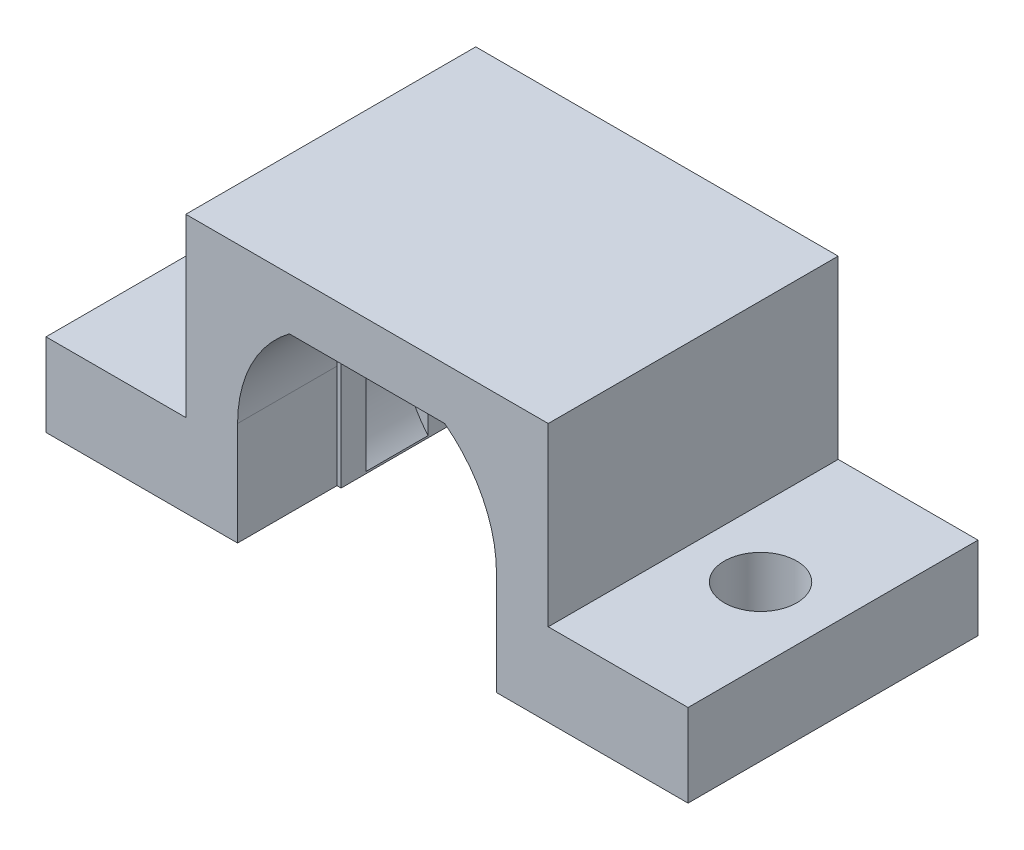
ISO-10303-21;
HEADER;
FILE_DESCRIPTION(('STEP AP214'),'2;1');
FILE_NAME('part.step','',(''),(''),'','','');
FILE_SCHEMA(('AUTOMOTIVE_DESIGN { 1 0 10303 214 1 1 1 1 }'));
ENDSEC;
DATA;
#1=APPLICATION_CONTEXT('core data for automotive mechanical design processes');
#2=APPLICATION_PROTOCOL_DEFINITION('international standard','automotive_design',2000,#1);
#3=PRODUCT_CONTEXT('',#1,'mechanical');
#4=PRODUCT('Part','Part','',(#3));
#5=PRODUCT_RELATED_PRODUCT_CATEGORY('part','',(#4));
#6=PRODUCT_DEFINITION_FORMATION('','',#4);
#7=PRODUCT_DEFINITION_CONTEXT('part definition',#1,'design');
#8=PRODUCT_DEFINITION('design','',#6,#7);
#9=PRODUCT_DEFINITION_SHAPE('','',#8);
#10=(LENGTH_UNIT() NAMED_UNIT(*) SI_UNIT(.MILLI.,.METRE.));
#11=(NAMED_UNIT(*) PLANE_ANGLE_UNIT() SI_UNIT($,.RADIAN.));
#12=(NAMED_UNIT(*) SI_UNIT($,.STERADIAN.) SOLID_ANGLE_UNIT());
#13=UNCERTAINTY_MEASURE_WITH_UNIT(LENGTH_MEASURE(1.E-05),#10,'distance_accuracy_value','');
#14=(GEOMETRIC_REPRESENTATION_CONTEXT(3) GLOBAL_UNCERTAINTY_ASSIGNED_CONTEXT((#13)) GLOBAL_UNIT_ASSIGNED_CONTEXT((#10,
#11,#12)) REPRESENTATION_CONTEXT('',''));
#15=CARTESIAN_POINT('',(0.,0.,0.));
#16=DIRECTION('',(0.,0.,1.));
#17=DIRECTION('',(1.,0.,0.));
#18=AXIS2_PLACEMENT_3D('',#15,#16,#17);
#19=CARTESIAN_POINT('',(-6.05,19.2021736562619,2.2));
#20=DIRECTION('',(1.,0.,0.));
#21=DIRECTION('',(0.,0.,-1.));
#22=AXIS2_PLACEMENT_3D('',#19,#20,#21);
#23=PLANE('',#22);
#24=DIRECTION('',(0.,-1.,0.));
#25=VECTOR('',#24,1.);
#26=CARTESIAN_POINT('',(-6.05,19.2021736562619,-7.));
#27=LINE('',#26,#25);
#28=CARTESIAN_POINT('',(-6.05,10.,-7.));
#29=VERTEX_POINT('',#28);
#30=CARTESIAN_POINT('',(-6.05,0.,-7.));
#31=VERTEX_POINT('',#30);
#32=EDGE_CURVE('E254',#29,#31,#27,.T.);
#33=ORIENTED_EDGE('',*,*,#32,.F.);
#34=DIRECTION('',(0.,0.,1.));
#35=VECTOR('',#34,1.);
#36=CARTESIAN_POINT('',(-6.05,10.,2.2));
#37=LINE('',#36,#35);
#38=CARTESIAN_POINT('',(-6.05,10.,2.2));
#39=VERTEX_POINT('',#38);
#40=EDGE_CURVE('E250',#29,#39,#37,.T.);
#41=ORIENTED_EDGE('',*,*,#40,.T.);
#42=DIRECTION('',(0.,-1.,0.));
#43=VECTOR('',#42,1.);
#44=CARTESIAN_POINT('',(-6.05,19.2021736562619,2.2));
#45=LINE('',#44,#43);
#46=CARTESIAN_POINT('',(-6.05,6.56843871413581,2.2));
#47=VERTEX_POINT('',#46);
#48=EDGE_CURVE('E259',#39,#47,#45,.T.);
#49=ORIENTED_EDGE('',*,*,#48,.T.);
#50=CARTESIAN_POINT('',(-6.05,0.,2.2));
#51=VERTEX_POINT('',#50);
#52=EDGE_CURVE('E253',#47,#51,#45,.T.);
#53=ORIENTED_EDGE('',*,*,#52,.T.);
#54=DIRECTION('',(0.,0.,1.));
#55=VECTOR('',#54,1.);
#56=CARTESIAN_POINT('',(-6.05,0.,2.2));
#57=LINE('',#56,#55);
#58=EDGE_CURVE('E242',#31,#51,#57,.T.);
#59=ORIENTED_EDGE('',*,*,#58,.F.);
#60=EDGE_LOOP('',(#33,#41,#49,#53,#59));
#61=FACE_BOUND('',#60,.T.);
#62=DIRECTION('',(0.,0.,1.));
#63=VECTOR('',#62,1.);
#64=CARTESIAN_POINT('',(-6.05,5.93643545649787,-2.));
#65=LINE('',#64,#63);
#66=CARTESIAN_POINT('',(-6.05,5.93643545649787,-2.));
#67=VERTEX_POINT('',#66);
#68=CARTESIAN_POINT('',(-6.05,5.93643545649787,1.));
#69=VERTEX_POINT('',#68);
#70=EDGE_CURVE('E412',#67,#69,#65,.T.);
#71=ORIENTED_EDGE('',*,*,#70,.F.);
#72=DIRECTION('',(0.,-1.,0.));
#73=VECTOR('',#72,1.);
#74=CARTESIAN_POINT('',(-6.05,19.2021736562619,-2.));
#75=LINE('',#74,#73);
#76=CARTESIAN_POINT('',(-6.05,0.0945535764110927,-2.));
#77=VERTEX_POINT('',#76);
#78=EDGE_CURVE('E415',#67,#77,#75,.T.);
#79=ORIENTED_EDGE('',*,*,#78,.T.);
#80=DIRECTION('',(0.,0.,1.));
#81=VECTOR('',#80,1.);
#82=CARTESIAN_POINT('',(-6.05,0.0945535764110927,-2.));
#83=LINE('',#82,#81);
#84=CARTESIAN_POINT('',(-6.05,0.0945535764110927,1.));
#85=VERTEX_POINT('',#84);
#86=EDGE_CURVE('E410',#85,#77,#83,.F.);
#87=ORIENTED_EDGE('',*,*,#86,.F.);
#88=DIRECTION('',(0.,-1.,0.));
#89=VECTOR('',#88,1.);
#90=CARTESIAN_POINT('',(-6.05,19.2021736562619,1.));
#91=LINE('',#90,#89);
#92=EDGE_CURVE('E408',#69,#85,#91,.T.);
#93=ORIENTED_EDGE('',*,*,#92,.F.);
#94=EDGE_LOOP('',(#71,#79,#87,#93));
#95=FACE_BOUND('',#94,.T.);
#96=ADVANCED_FACE('F32',(#61,#95),#23,.T.);
#97=CARTESIAN_POINT('',(0.,5.,7.));
#98=DIRECTION('',(0.,0.,-1.));
#99=DIRECTION('',(-1.,0.,0.));
#100=AXIS2_PLACEMENT_3D('',#97,#98,#99);
#101=CYLINDRICAL_SURFACE('',#100,6.25);
#102=CARTESIAN_POINT('',(0.,5.,2.2));
#103=DIRECTION('',(0.,0.,-1.));
#104=DIRECTION('',(-1.,0.,0.));
#105=AXIS2_PLACEMENT_3D('',#102,#103,#104);
#106=CIRCLE('',#105,6.25);
#107=CARTESIAN_POINT('',(-3.75,10.,2.2));
#108=VERTEX_POINT('',#107);
#109=EDGE_CURVE('E303',#108,#47,#106,.F.);
#110=ORIENTED_EDGE('',*,*,#109,.F.);
#111=DIRECTION('',(0.,0.,-1.));
#112=VECTOR('',#111,1.);
#113=CARTESIAN_POINT('',(-3.75,10.,7.));
#114=LINE('',#113,#112);
#115=CARTESIAN_POINT('',(-3.75,10.,7.));
#116=VERTEX_POINT('',#115);
#117=EDGE_CURVE('E391',#116,#108,#114,.T.);
#118=ORIENTED_EDGE('',*,*,#117,.F.);
#119=CARTESIAN_POINT('',(0.,5.,7.));
#120=DIRECTION('',(0.,0.,-1.));
#121=DIRECTION('',(1.,0.,0.));
#122=AXIS2_PLACEMENT_3D('',#119,#120,#121);
#123=CIRCLE('',#122,6.25);
#124=CARTESIAN_POINT('',(-6.25,5.,7.));
#125=VERTEX_POINT('',#124);
#126=EDGE_CURVE('E320',#125,#116,#123,.T.);
#127=ORIENTED_EDGE('',*,*,#126,.F.);
#128=DIRECTION('',(0.,0.,-1.));
#129=VECTOR('',#128,1.);
#130=CARTESIAN_POINT('',(-6.25,5.,7.));
#131=LINE('',#130,#129);
#132=CARTESIAN_POINT('',(-6.25,5.,2.2));
#133=VERTEX_POINT('',#132);
#134=EDGE_CURVE('E394',#125,#133,#131,.T.);
#135=ORIENTED_EDGE('',*,*,#134,.T.);
#136=EDGE_CURVE('E302',#47,#133,#106,.F.);
#137=ORIENTED_EDGE('',*,*,#136,.F.);
#138=EDGE_LOOP('',(#110,#118,#127,#135,#137));
#139=FACE_BOUND('',#138,.T.);
#140=ADVANCED_FACE('F462',(#139),#101,.F.);
#141=CARTESIAN_POINT('',(0.,5.,7.));
#142=DIRECTION('',(0.,0.,-1.));
#143=DIRECTION('',(-1.,0.,0.));
#144=AXIS2_PLACEMENT_3D('',#141,#142,#143);
#145=CYLINDRICAL_SURFACE('',#144,6.25);
#146=CARTESIAN_POINT('',(0.,5.,2.2));
#147=DIRECTION('',(0.,0.,-1.));
#148=DIRECTION('',(-1.,0.,0.));
#149=AXIS2_PLACEMENT_3D('',#146,#147,#148);
#150=CIRCLE('',#149,6.25);
#151=CARTESIAN_POINT('',(6.25,5.,2.2));
#152=VERTEX_POINT('',#151);
#153=CARTESIAN_POINT('',(6.05,6.56843871413581,2.2));
#154=VERTEX_POINT('',#153);
#155=EDGE_CURVE('E403',#152,#154,#150,.F.);
#156=ORIENTED_EDGE('',*,*,#155,.F.);
#157=DIRECTION('',(0.,0.,-1.));
#158=VECTOR('',#157,1.);
#159=CARTESIAN_POINT('',(6.25,5.,7.));
#160=LINE('',#159,#158);
#161=CARTESIAN_POINT('',(6.25,5.,7.));
#162=VERTEX_POINT('',#161);
#163=EDGE_CURVE('E385',#162,#152,#160,.T.);
#164=ORIENTED_EDGE('',*,*,#163,.F.);
#165=CARTESIAN_POINT('',(0.,5.,7.));
#166=DIRECTION('',(0.,0.,-1.));
#167=DIRECTION('',(1.,0.,0.));
#168=AXIS2_PLACEMENT_3D('',#165,#166,#167);
#169=CIRCLE('',#168,6.25);
#170=CARTESIAN_POINT('',(3.75,10.,7.));
#171=VERTEX_POINT('',#170);
#172=EDGE_CURVE('E324',#171,#162,#169,.T.);
#173=ORIENTED_EDGE('',*,*,#172,.F.);
#174=DIRECTION('',(0.,0.,-1.));
#175=VECTOR('',#174,1.);
#176=CARTESIAN_POINT('',(3.75,10.,7.));
#177=LINE('',#176,#175);
#178=CARTESIAN_POINT('',(3.75,10.,2.2));
#179=VERTEX_POINT('',#178);
#180=EDGE_CURVE('E388',#171,#179,#177,.T.);
#181=ORIENTED_EDGE('',*,*,#180,.T.);
#182=EDGE_CURVE('E402',#154,#179,#150,.F.);
#183=ORIENTED_EDGE('',*,*,#182,.F.);
#184=EDGE_LOOP('',(#156,#164,#173,#181,#183));
#185=FACE_BOUND('',#184,.T.);
#186=ADVANCED_FACE('F468',(#185),#145,.F.);
#187=CARTESIAN_POINT('',(-15.5,4.,7.));
#188=DIRECTION('',(1.,0.,0.));
#189=DIRECTION('',(0.,0.,-1.));
#190=AXIS2_PLACEMENT_3D('',#187,#188,#189);
#191=PLANE('',#190);
#192=DIRECTION('',(0.,-1.,0.));
#193=VECTOR('',#192,1.);
#194=CARTESIAN_POINT('',(-15.5,4.,-7.));
#195=LINE('',#194,#193);
#196=CARTESIAN_POINT('',(-15.5,4.,-7.));
#197=VERTEX_POINT('',#196);
#198=CARTESIAN_POINT('',(-15.5,0.,-7.));
#199=VERTEX_POINT('',#198);
#200=EDGE_CURVE('E311',#197,#199,#195,.T.);
#201=ORIENTED_EDGE('',*,*,#200,.T.);
#202=DIRECTION('',(0.,0.,-1.));
#203=VECTOR('',#202,1.);
#204=CARTESIAN_POINT('',(-15.5,0.,7.));
#205=LINE('',#204,#203);
#206=CARTESIAN_POINT('',(-15.5,0.,7.));
#207=VERTEX_POINT('',#206);
#208=EDGE_CURVE('E399',#207,#199,#205,.T.);
#209=ORIENTED_EDGE('',*,*,#208,.F.);
#210=DIRECTION('',(0.,-1.,0.));
#211=VECTOR('',#210,1.);
#212=CARTESIAN_POINT('',(-15.5,4.,7.));
#213=LINE('',#212,#211);
#214=CARTESIAN_POINT('',(-15.5,4.,7.));
#215=VERTEX_POINT('',#214);
#216=EDGE_CURVE('E312',#215,#207,#213,.T.);
#217=ORIENTED_EDGE('',*,*,#216,.F.);
#218=DIRECTION('',(0.,0.,-1.));
#219=VECTOR('',#218,1.);
#220=CARTESIAN_POINT('',(-15.5,4.,7.));
#221=LINE('',#220,#219);
#222=EDGE_CURVE('E342',#215,#197,#221,.T.);
#223=ORIENTED_EDGE('',*,*,#222,.T.);
#224=EDGE_LOOP('',(#201,#209,#217,#223));
#225=FACE_BOUND('',#224,.T.);
#226=ADVANCED_FACE('F34',(#225),#191,.F.);
#227=CARTESIAN_POINT('',(-15.5,0.,7.));
#228=DIRECTION('',(0.,1.,0.));
#229=DIRECTION('',(0.,0.,1.));
#230=AXIS2_PLACEMENT_3D('',#227,#228,#229);
#231=PLANE('',#230);
#232=CARTESIAN_POINT('',(-12.,0.,0.));
#233=DIRECTION('',(0.,1.,0.));
#234=DIRECTION('',(0.,0.,1.));
#235=AXIS2_PLACEMENT_3D('',#232,#233,#234);
#236=CIRCLE('',#235,1.75);
#237=CARTESIAN_POINT('',(-12.,0.,1.75));
#238=VERTEX_POINT('',#237);
#239=EDGE_CURVE('E308',#238,#238,#236,.T.);
#240=ORIENTED_EDGE('',*,*,#239,.T.);
#241=EDGE_LOOP('',(#240));
#242=FACE_BOUND('',#241,.T.);
#243=DIRECTION('',(1.,0.,0.));
#244=VECTOR('',#243,1.);
#245=CARTESIAN_POINT('',(-15.5,0.,-7.));
#246=LINE('',#245,#244);
#247=EDGE_CURVE('E345',#199,#31,#246,.T.);
#248=ORIENTED_EDGE('',*,*,#247,.T.);
#249=ORIENTED_EDGE('',*,*,#58,.T.);
#250=DIRECTION('',(-1.,0.,0.));
#251=VECTOR('',#250,1.);
#252=CARTESIAN_POINT('',(-6.05,0.,2.2));
#253=LINE('',#252,#251);
#254=CARTESIAN_POINT('',(-6.25,0.,2.2));
#255=VERTEX_POINT('',#254);
#256=EDGE_CURVE('E244',#51,#255,#253,.T.);
#257=ORIENTED_EDGE('',*,*,#256,.T.);
#258=DIRECTION('',(0.,0.,-1.));
#259=VECTOR('',#258,1.);
#260=CARTESIAN_POINT('',(-6.25,0.,7.));
#261=LINE('',#260,#259);
#262=CARTESIAN_POINT('',(-6.25,0.,7.));
#263=VERTEX_POINT('',#262);
#264=EDGE_CURVE('E397',#263,#255,#261,.T.);
#265=ORIENTED_EDGE('',*,*,#264,.F.);
#266=DIRECTION('',(1.,0.,0.));
#267=VECTOR('',#266,1.);
#268=CARTESIAN_POINT('',(-15.5,0.,7.));
#269=LINE('',#268,#267);
#270=EDGE_CURVE('E315',#207,#263,#269,.T.);
#271=ORIENTED_EDGE('',*,*,#270,.F.);
#272=ORIENTED_EDGE('',*,*,#208,.T.);
#273=EDGE_LOOP('',(#248,#249,#257,#265,#271,#272));
#274=FACE_BOUND('',#273,.T.);
#275=ADVANCED_FACE('F522',(#242,#274),#231,.F.);
#276=CARTESIAN_POINT('',(-6.25,5.,7.));
#277=DIRECTION('',(-1.,0.,0.));
#278=DIRECTION('',(0.,-1.,0.));
#279=AXIS2_PLACEMENT_3D('',#276,#277,#278);
#280=PLANE('',#279);
#281=ORIENTED_EDGE('',*,*,#264,.T.);
#282=DIRECTION('',(0.,-1.,0.));
#283=VECTOR('',#282,1.);
#284=CARTESIAN_POINT('',(-6.25,19.2021736562619,2.2));
#285=LINE('',#284,#283);
#286=EDGE_CURVE('E247',#133,#255,#285,.T.);
#287=ORIENTED_EDGE('',*,*,#286,.F.);
#288=ORIENTED_EDGE('',*,*,#134,.F.);
#289=DIRECTION('',(0.,1.,0.));
#290=VECTOR('',#289,1.);
#291=CARTESIAN_POINT('',(-6.25,5.,7.));
#292=LINE('',#291,#290);
#293=EDGE_CURVE('E318',#263,#125,#292,.T.);
#294=ORIENTED_EDGE('',*,*,#293,.F.);
#295=EDGE_LOOP('',(#281,#287,#288,#294));
#296=FACE_BOUND('',#295,.T.);
#297=ADVANCED_FACE('F586',(#296),#280,.F.);
#298=CARTESIAN_POINT('',(-3.75,10.,7.));
#299=DIRECTION('',(0.,1.,0.));
#300=DIRECTION('',(0.,0.,1.));
#301=AXIS2_PLACEMENT_3D('',#298,#299,#300);
#302=PLANE('',#301);
#303=DIRECTION('',(0.,0.,1.));
#304=VECTOR('',#303,1.);
#305=CARTESIAN_POINT('',(5.37682403794214,10.,-3.8));
#306=LINE('',#305,#304);
#307=CARTESIAN_POINT('',(5.37682403794213,10.,-3.8));
#308=VERTEX_POINT('',#307);
#309=CARTESIAN_POINT('',(5.37682403794213,10.,-1.8));
#310=VERTEX_POINT('',#309);
#311=EDGE_CURVE('E227',#308,#310,#306,.T.);
#312=ORIENTED_EDGE('',*,*,#311,.F.);
#313=DIRECTION('',(-1.,0.,0.));
#314=VECTOR('',#313,1.);
#315=CARTESIAN_POINT('',(-3.75,10.,-3.8));
#316=LINE('',#315,#314);
#317=CARTESIAN_POINT('',(0.859966022637954,10.,-3.8));
#318=VERTEX_POINT('',#317);
#319=EDGE_CURVE('E219',#308,#318,#316,.T.);
#320=ORIENTED_EDGE('',*,*,#319,.T.);
#321=DIRECTION('',(0.,0.,1.));
#322=VECTOR('',#321,1.);
#323=CARTESIAN_POINT('',(0.859966022637952,10.,-3.8));
#324=LINE('',#323,#322);
#325=CARTESIAN_POINT('',(0.859966022637954,10.,-1.8));
#326=VERTEX_POINT('',#325);
#327=EDGE_CURVE('E225',#326,#318,#324,.F.);
#328=ORIENTED_EDGE('',*,*,#327,.F.);
#329=DIRECTION('',(-1.,0.,0.));
#330=VECTOR('',#329,1.);
#331=CARTESIAN_POINT('',(-3.75,10.,-1.8));
#332=LINE('',#331,#330);
#333=EDGE_CURVE('E214',#310,#326,#332,.T.);
#334=ORIENTED_EDGE('',*,*,#333,.F.);
#335=EDGE_LOOP('',(#312,#320,#328,#334));
#336=FACE_BOUND('',#335,.T.);
#337=DIRECTION('',(1.,0.,0.));
#338=VECTOR('',#337,1.);
#339=CARTESIAN_POINT('',(-6.25,10.,2.2));
#340=LINE('',#339,#338);
#341=EDGE_CURVE('E300',#39,#108,#340,.T.);
#342=ORIENTED_EDGE('',*,*,#341,.F.);
#343=ORIENTED_EDGE('',*,*,#40,.F.);
#344=DIRECTION('',(1.,0.,0.));
#345=VECTOR('',#344,1.);
#346=CARTESIAN_POINT('',(-3.75,10.,-7.));
#347=LINE('',#346,#345);
#348=CARTESIAN_POINT('',(6.05,10.,-7.));
#349=VERTEX_POINT('',#348);
#350=EDGE_CURVE('E347',#29,#349,#347,.T.);
#351=ORIENTED_EDGE('',*,*,#350,.T.);
#352=DIRECTION('',(0.,0.,-1.));
#353=VECTOR('',#352,1.);
#354=CARTESIAN_POINT('',(6.05,10.,2.2));
#355=LINE('',#354,#353);
#356=CARTESIAN_POINT('',(6.05,10.,-0.8));
#357=VERTEX_POINT('',#356);
#358=EDGE_CURVE('E272',#357,#349,#355,.T.);
#359=ORIENTED_EDGE('',*,*,#358,.F.);
#360=DIRECTION('',(1.,0.,0.));
#361=VECTOR('',#360,1.);
#362=CARTESIAN_POINT('',(3.75,10.,-0.8));
#363=LINE('',#362,#361);
#364=CARTESIAN_POINT('',(3.75,10.,-0.8));
#365=VERTEX_POINT('',#364);
#366=EDGE_CURVE('E287',#365,#357,#363,.T.);
#367=ORIENTED_EDGE('',*,*,#366,.F.);
#368=DIRECTION('',(0.,0.,1.));
#369=VECTOR('',#368,1.);
#370=CARTESIAN_POINT('',(3.75,10.,-0.8));
#371=LINE('',#370,#369);
#372=CARTESIAN_POINT('',(3.75,10.,1.));
#373=VERTEX_POINT('',#372);
#374=EDGE_CURVE('E293',#365,#373,#371,.T.);
#375=ORIENTED_EDGE('',*,*,#374,.T.);
#376=DIRECTION('',(1.,0.,0.));
#377=VECTOR('',#376,1.);
#378=CARTESIAN_POINT('',(3.75,10.,1.));
#379=LINE('',#378,#377);
#380=CARTESIAN_POINT('',(6.05,10.,1.));
#381=VERTEX_POINT('',#380);
#382=EDGE_CURVE('E286',#373,#381,#379,.T.);
#383=ORIENTED_EDGE('',*,*,#382,.T.);
#384=CARTESIAN_POINT('',(6.05,10.,2.2));
#385=VERTEX_POINT('',#384);
#386=EDGE_CURVE('E269',#385,#381,#355,.T.);
#387=ORIENTED_EDGE('',*,*,#386,.F.);
#388=EDGE_CURVE('E299',#179,#385,#340,.T.);
#389=ORIENTED_EDGE('',*,*,#388,.F.);
#390=ORIENTED_EDGE('',*,*,#180,.F.);
#391=DIRECTION('',(1.,0.,0.));
#392=VECTOR('',#391,1.);
#393=CARTESIAN_POINT('',(-3.75,10.,7.));
#394=LINE('',#393,#392);
#395=EDGE_CURVE('E322',#116,#171,#394,.T.);
#396=ORIENTED_EDGE('',*,*,#395,.F.);
#397=ORIENTED_EDGE('',*,*,#117,.T.);
#398=EDGE_LOOP('',(#342,#343,#351,#359,#367,#375,#383,#387,#389,#390,#396,#397));
#399=FACE_BOUND('',#398,.T.);
#400=ADVANCED_FACE('F231',(#336,#399),#302,.F.);
#401=CARTESIAN_POINT('',(6.25,5.,7.));
#402=DIRECTION('',(1.,0.,0.));
#403=DIRECTION('',(0.,1.,0.));
#404=AXIS2_PLACEMENT_3D('',#401,#402,#403);
#405=PLANE('',#404);
#406=ORIENTED_EDGE('',*,*,#163,.T.);
#407=DIRECTION('',(0.,-1.,0.));
#408=VECTOR('',#407,1.);
#409=CARTESIAN_POINT('',(6.25,19.2021736562619,2.2));
#410=LINE('',#409,#408);
#411=CARTESIAN_POINT('',(6.25,0.,2.2));
#412=VERTEX_POINT('',#411);
#413=EDGE_CURVE('E266',#152,#412,#410,.T.);
#414=ORIENTED_EDGE('',*,*,#413,.T.);
#415=DIRECTION('',(0.,0.,-1.));
#416=VECTOR('',#415,1.);
#417=CARTESIAN_POINT('',(6.25,0.,7.));
#418=LINE('',#417,#416);
#419=CARTESIAN_POINT('',(6.25,0.,7.));
#420=VERTEX_POINT('',#419);
#421=EDGE_CURVE('E382',#420,#412,#418,.T.);
#422=ORIENTED_EDGE('',*,*,#421,.F.);
#423=DIRECTION('',(0.,-1.,0.));
#424=VECTOR('',#423,1.);
#425=CARTESIAN_POINT('',(6.25,5.,7.));
#426=LINE('',#425,#424);
#427=EDGE_CURVE('E326',#162,#420,#426,.T.);
#428=ORIENTED_EDGE('',*,*,#427,.F.);
#429=EDGE_LOOP('',(#406,#414,#422,#428));
#430=FACE_BOUND('',#429,.T.);
#431=ADVANCED_FACE('F590',(#430),#405,.F.);
#432=CARTESIAN_POINT('',(6.25,0.,7.));
#433=DIRECTION('',(0.,1.,0.));
#434=DIRECTION('',(0.,0.,1.));
#435=AXIS2_PLACEMENT_3D('',#432,#433,#434);
#436=PLANE('',#435);
#437=CARTESIAN_POINT('',(12.,0.,0.));
#438=DIRECTION('',(0.,1.,0.));
#439=DIRECTION('',(0.,0.,1.));
#440=AXIS2_PLACEMENT_3D('',#437,#438,#439);
#441=CIRCLE('',#440,1.75);
#442=CARTESIAN_POINT('',(12.,0.,1.75));
#443=VERTEX_POINT('',#442);
#444=EDGE_CURVE('E305',#443,#443,#441,.T.);
#445=ORIENTED_EDGE('',*,*,#444,.T.);
#446=EDGE_LOOP('',(#445));
#447=FACE_BOUND('',#446,.T.);
#448=DIRECTION('',(1.,0.,0.));
#449=VECTOR('',#448,1.);
#450=CARTESIAN_POINT('',(6.25,0.,-7.));
#451=LINE('',#450,#449);
#452=CARTESIAN_POINT('',(6.05,0.,-7.));
#453=VERTEX_POINT('',#452);
#454=CARTESIAN_POINT('',(15.5,0.,-7.));
#455=VERTEX_POINT('',#454);
#456=EDGE_CURVE('E349',#453,#455,#451,.T.);
#457=ORIENTED_EDGE('',*,*,#456,.T.);
#458=DIRECTION('',(0.,0.,-1.));
#459=VECTOR('',#458,1.);
#460=CARTESIAN_POINT('',(15.5,0.,7.));
#461=LINE('',#460,#459);
#462=CARTESIAN_POINT('',(15.5,0.,7.));
#463=VERTEX_POINT('',#462);
#464=EDGE_CURVE('E379',#463,#455,#461,.T.);
#465=ORIENTED_EDGE('',*,*,#464,.F.);
#466=DIRECTION('',(1.,0.,0.));
#467=VECTOR('',#466,1.);
#468=CARTESIAN_POINT('',(6.25,0.,7.));
#469=LINE('',#468,#467);
#470=EDGE_CURVE('E328',#420,#463,#469,.T.);
#471=ORIENTED_EDGE('',*,*,#470,.F.);
#472=ORIENTED_EDGE('',*,*,#421,.T.);
#473=DIRECTION('',(-1.,0.,0.));
#474=VECTOR('',#473,1.);
#475=CARTESIAN_POINT('',(6.05,0.,2.2));
#476=LINE('',#475,#474);
#477=CARTESIAN_POINT('',(6.05,0.,2.2));
#478=VERTEX_POINT('',#477);
#479=EDGE_CURVE('E263',#412,#478,#476,.T.);
#480=ORIENTED_EDGE('',*,*,#479,.T.);
#481=DIRECTION('',(0.,0.,-1.));
#482=VECTOR('',#481,1.);
#483=CARTESIAN_POINT('',(6.05,0.,2.2));
#484=LINE('',#483,#482);
#485=EDGE_CURVE('E262',#478,#453,#484,.T.);
#486=ORIENTED_EDGE('',*,*,#485,.T.);
#487=EDGE_LOOP('',(#457,#465,#471,#472,#480,#486));
#488=FACE_BOUND('',#487,.T.);
#489=ADVANCED_FACE('F557',(#447,#488),#436,.F.);
#490=CARTESIAN_POINT('',(15.5,0.,7.));
#491=DIRECTION('',(-1.,0.,0.));
#492=DIRECTION('',(0.,0.,1.));
#493=AXIS2_PLACEMENT_3D('',#490,#491,#492);
#494=PLANE('',#493);
#495=DIRECTION('',(0.,1.,0.));
#496=VECTOR('',#495,1.);
#497=CARTESIAN_POINT('',(15.5,0.,-7.));
#498=LINE('',#497,#496);
#499=CARTESIAN_POINT('',(15.5,4.,-7.));
#500=VERTEX_POINT('',#499);
#501=EDGE_CURVE('E351',#455,#500,#498,.T.);
#502=ORIENTED_EDGE('',*,*,#501,.T.);
#503=DIRECTION('',(0.,0.,-1.));
#504=VECTOR('',#503,1.);
#505=CARTESIAN_POINT('',(15.5,4.,7.));
#506=LINE('',#505,#504);
#507=CARTESIAN_POINT('',(15.5,4.,7.));
#508=VERTEX_POINT('',#507);
#509=EDGE_CURVE('E376',#508,#500,#506,.T.);
#510=ORIENTED_EDGE('',*,*,#509,.F.);
#511=DIRECTION('',(0.,1.,0.));
#512=VECTOR('',#511,1.);
#513=CARTESIAN_POINT('',(15.5,0.,7.));
#514=LINE('',#513,#512);
#515=EDGE_CURVE('E330',#463,#508,#514,.T.);
#516=ORIENTED_EDGE('',*,*,#515,.F.);
#517=ORIENTED_EDGE('',*,*,#464,.T.);
#518=EDGE_LOOP('',(#502,#510,#516,#517));
#519=FACE_BOUND('',#518,.T.);
#520=ADVANCED_FACE('F552',(#519),#494,.F.);
#521=CARTESIAN_POINT('',(15.5,4.,7.));
#522=DIRECTION('',(0.,-1.,0.));
#523=DIRECTION('',(1.,0.,0.));
#524=AXIS2_PLACEMENT_3D('',#521,#522,#523);
#525=PLANE('',#524);
#526=DIRECTION('',(-1.,0.,0.));
#527=VECTOR('',#526,1.);
#528=CARTESIAN_POINT('',(15.5,4.,-7.));
#529=LINE('',#528,#527);
#530=CARTESIAN_POINT('',(8.75,4.,-7.));
#531=VERTEX_POINT('',#530);
#532=EDGE_CURVE('E353',#500,#531,#529,.T.);
#533=ORIENTED_EDGE('',*,*,#532,.T.);
#534=DIRECTION('',(0.,0.,-1.));
#535=VECTOR('',#534,1.);
#536=CARTESIAN_POINT('',(8.75,4.,7.));
#537=LINE('',#536,#535);
#538=CARTESIAN_POINT('',(8.75,4.,7.));
#539=VERTEX_POINT('',#538);
#540=EDGE_CURVE('E373',#539,#531,#537,.T.);
#541=ORIENTED_EDGE('',*,*,#540,.F.);
#542=DIRECTION('',(-1.,0.,0.));
#543=VECTOR('',#542,1.);
#544=CARTESIAN_POINT('',(15.5,4.,7.));
#545=LINE('',#544,#543);
#546=EDGE_CURVE('E332',#508,#539,#545,.T.);
#547=ORIENTED_EDGE('',*,*,#546,.F.);
#548=ORIENTED_EDGE('',*,*,#509,.T.);
#549=EDGE_LOOP('',(#533,#541,#547,#548));
#550=FACE_BOUND('',#549,.T.);
#551=CARTESIAN_POINT('',(12.,4.,0.));
#552=DIRECTION('',(0.,1.,0.));
#553=DIRECTION('',(0.,0.,1.));
#554=AXIS2_PLACEMENT_3D('',#551,#552,#553);
#555=CIRCLE('',#554,1.75);
#556=CARTESIAN_POINT('',(12.,4.,1.75));
#557=VERTEX_POINT('',#556);
#558=EDGE_CURVE('E435',#557,#557,#555,.T.);
#559=ORIENTED_EDGE('',*,*,#558,.F.);
#560=EDGE_LOOP('',(#559));
#561=FACE_BOUND('',#560,.T.);
#562=ADVANCED_FACE('F547',(#550,#561),#525,.F.);
#563=CARTESIAN_POINT('',(8.75,4.,7.));
#564=DIRECTION('',(-1.,0.,0.));
#565=DIRECTION('',(0.,-1.,0.));
#566=AXIS2_PLACEMENT_3D('',#563,#564,#565);
#567=PLANE('',#566);
#568=DIRECTION('',(0.,1.,0.));
#569=VECTOR('',#568,1.);
#570=CARTESIAN_POINT('',(8.75,4.,-7.));
#571=LINE('',#570,#569);
#572=CARTESIAN_POINT('',(8.75,12.5,-7.));
#573=VERTEX_POINT('',#572);
#574=EDGE_CURVE('E355',#531,#573,#571,.T.);
#575=ORIENTED_EDGE('',*,*,#574,.T.);
#576=DIRECTION('',(0.,0.,-1.));
#577=VECTOR('',#576,1.);
#578=CARTESIAN_POINT('',(8.75,12.5,7.));
#579=LINE('',#578,#577);
#580=CARTESIAN_POINT('',(8.75,12.5,7.));
#581=VERTEX_POINT('',#580);
#582=EDGE_CURVE('E370',#581,#573,#579,.T.);
#583=ORIENTED_EDGE('',*,*,#582,.F.);
#584=DIRECTION('',(0.,1.,0.));
#585=VECTOR('',#584,1.);
#586=CARTESIAN_POINT('',(8.75,4.,7.));
#587=LINE('',#586,#585);
#588=EDGE_CURVE('E334',#539,#581,#587,.T.);
#589=ORIENTED_EDGE('',*,*,#588,.F.);
#590=ORIENTED_EDGE('',*,*,#540,.T.);
#591=EDGE_LOOP('',(#575,#583,#589,#590));
#592=FACE_BOUND('',#591,.T.);
#593=ADVANCED_FACE('F543',(#592),#567,.F.);
#594=CARTESIAN_POINT('',(8.75,12.5,7.));
#595=DIRECTION('',(0.,-1.,0.));
#596=DIRECTION('',(0.,0.,-1.));
#597=AXIS2_PLACEMENT_3D('',#594,#595,#596);
#598=PLANE('',#597);
#599=DIRECTION('',(-1.,0.,0.));
#600=VECTOR('',#599,1.);
#601=CARTESIAN_POINT('',(8.75,12.5,-7.));
#602=LINE('',#601,#600);
#603=CARTESIAN_POINT('',(-8.75,12.5,-7.));
#604=VERTEX_POINT('',#603);
#605=EDGE_CURVE('E357',#573,#604,#602,.T.);
#606=ORIENTED_EDGE('',*,*,#605,.T.);
#607=DIRECTION('',(0.,0.,-1.));
#608=VECTOR('',#607,1.);
#609=CARTESIAN_POINT('',(-8.75,12.5,7.));
#610=LINE('',#609,#608);
#611=CARTESIAN_POINT('',(-8.75,12.5,7.));
#612=VERTEX_POINT('',#611);
#613=EDGE_CURVE('E367',#612,#604,#610,.T.);
#614=ORIENTED_EDGE('',*,*,#613,.F.);
#615=DIRECTION('',(-1.,0.,0.));
#616=VECTOR('',#615,1.);
#617=CARTESIAN_POINT('',(8.75,12.5,7.));
#618=LINE('',#617,#616);
#619=EDGE_CURVE('E336',#581,#612,#618,.T.);
#620=ORIENTED_EDGE('',*,*,#619,.F.);
#621=ORIENTED_EDGE('',*,*,#582,.T.);
#622=EDGE_LOOP('',(#606,#614,#620,#621));
#623=FACE_BOUND('',#622,.T.);
#624=ADVANCED_FACE('F457',(#623),#598,.F.);
#625=CARTESIAN_POINT('',(-8.75,12.5,7.));
#626=DIRECTION('',(1.,0.,0.));
#627=DIRECTION('',(0.,1.,0.));
#628=AXIS2_PLACEMENT_3D('',#625,#626,#627);
#629=PLANE('',#628);
#630=DIRECTION('',(0.,-1.,0.));
#631=VECTOR('',#630,1.);
#632=CARTESIAN_POINT('',(-8.75,12.5,-7.));
#633=LINE('',#632,#631);
#634=CARTESIAN_POINT('',(-8.75,4.,-7.));
#635=VERTEX_POINT('',#634);
#636=EDGE_CURVE('E359',#604,#635,#633,.T.);
#637=ORIENTED_EDGE('',*,*,#636,.T.);
#638=DIRECTION('',(0.,0.,-1.));
#639=VECTOR('',#638,1.);
#640=CARTESIAN_POINT('',(-8.75,4.,7.));
#641=LINE('',#640,#639);
#642=CARTESIAN_POINT('',(-8.75,4.,7.));
#643=VERTEX_POINT('',#642);
#644=EDGE_CURVE('E364',#643,#635,#641,.T.);
#645=ORIENTED_EDGE('',*,*,#644,.F.);
#646=DIRECTION('',(0.,-1.,0.));
#647=VECTOR('',#646,1.);
#648=CARTESIAN_POINT('',(-8.75,12.5,7.));
#649=LINE('',#648,#647);
#650=EDGE_CURVE('E338',#612,#643,#649,.T.);
#651=ORIENTED_EDGE('',*,*,#650,.F.);
#652=ORIENTED_EDGE('',*,*,#613,.T.);
#653=EDGE_LOOP('',(#637,#645,#651,#652));
#654=FACE_BOUND('',#653,.T.);
#655=ADVANCED_FACE('F447',(#654),#629,.F.);
#656=CARTESIAN_POINT('',(-8.75,4.,7.));
#657=DIRECTION('',(0.,-1.,0.));
#658=DIRECTION('',(1.,0.,0.));
#659=AXIS2_PLACEMENT_3D('',#656,#657,#658);
#660=PLANE('',#659);
#661=DIRECTION('',(-1.,0.,0.));
#662=VECTOR('',#661,1.);
#663=CARTESIAN_POINT('',(-8.75,4.,-7.));
#664=LINE('',#663,#662);
#665=EDGE_CURVE('E316',#635,#197,#664,.T.);
#666=ORIENTED_EDGE('',*,*,#665,.T.);
#667=ORIENTED_EDGE('',*,*,#222,.F.);
#668=DIRECTION('',(-1.,0.,0.));
#669=VECTOR('',#668,1.);
#670=CARTESIAN_POINT('',(-8.75,4.,7.));
#671=LINE('',#670,#669);
#672=EDGE_CURVE('E340',#643,#215,#671,.T.);
#673=ORIENTED_EDGE('',*,*,#672,.F.);
#674=ORIENTED_EDGE('',*,*,#644,.T.);
#675=EDGE_LOOP('',(#666,#667,#673,#674));
#676=FACE_BOUND('',#675,.T.);
#677=CARTESIAN_POINT('',(-12.,4.,0.));
#678=DIRECTION('',(0.,1.,0.));
#679=DIRECTION('',(0.,0.,1.));
#680=AXIS2_PLACEMENT_3D('',#677,#678,#679);
#681=CIRCLE('',#680,1.75);
#682=CARTESIAN_POINT('',(-12.,4.,1.75));
#683=VERTEX_POINT('',#682);
#684=EDGE_CURVE('E438',#683,#683,#681,.T.);
#685=ORIENTED_EDGE('',*,*,#684,.F.);
#686=EDGE_LOOP('',(#685));
#687=FACE_BOUND('',#686,.T.);
#688=ADVANCED_FACE('F444',(#676,#687),#660,.F.);
#689=CARTESIAN_POINT('',(0.,5.,7.));
#690=DIRECTION('',(0.,0.,1.));
#691=DIRECTION('',(1.,0.,0.));
#692=AXIS2_PLACEMENT_3D('',#689,#690,#691);
#693=PLANE('',#692);
#694=ORIENTED_EDGE('',*,*,#216,.T.);
#695=ORIENTED_EDGE('',*,*,#270,.T.);
#696=ORIENTED_EDGE('',*,*,#293,.T.);
#697=ORIENTED_EDGE('',*,*,#126,.T.);
#698=ORIENTED_EDGE('',*,*,#395,.T.);
#699=ORIENTED_EDGE('',*,*,#172,.T.);
#700=ORIENTED_EDGE('',*,*,#427,.T.);
#701=ORIENTED_EDGE('',*,*,#470,.T.);
#702=ORIENTED_EDGE('',*,*,#515,.T.);
#703=ORIENTED_EDGE('',*,*,#546,.T.);
#704=ORIENTED_EDGE('',*,*,#588,.T.);
#705=ORIENTED_EDGE('',*,*,#619,.T.);
#706=ORIENTED_EDGE('',*,*,#650,.T.);
#707=ORIENTED_EDGE('',*,*,#672,.T.);
#708=EDGE_LOOP('',(#694,#695,#696,#697,#698,#699,#700,#701,#702,#703,#704,#705,#706,#707));
#709=FACE_BOUND('',#708,.T.);
#710=ADVANCED_FACE('F446',(#709),#693,.T.);
#711=CARTESIAN_POINT('',(0.,5.,-7.));
#712=DIRECTION('',(0.,0.,1.));
#713=DIRECTION('',(1.,0.,0.));
#714=AXIS2_PLACEMENT_3D('',#711,#712,#713);
#715=PLANE('',#714);
#716=ORIENTED_EDGE('',*,*,#350,.F.);
#717=ORIENTED_EDGE('',*,*,#32,.T.);
#718=ORIENTED_EDGE('',*,*,#247,.F.);
#719=ORIENTED_EDGE('',*,*,#200,.F.);
#720=ORIENTED_EDGE('',*,*,#665,.F.);
#721=ORIENTED_EDGE('',*,*,#636,.F.);
#722=ORIENTED_EDGE('',*,*,#605,.F.);
#723=ORIENTED_EDGE('',*,*,#574,.F.);
#724=ORIENTED_EDGE('',*,*,#532,.F.);
#725=ORIENTED_EDGE('',*,*,#501,.F.);
#726=ORIENTED_EDGE('',*,*,#456,.F.);
#727=DIRECTION('',(0.,-1.,0.));
#728=VECTOR('',#727,1.);
#729=CARTESIAN_POINT('',(6.05,19.2021736562619,-7.));
#730=LINE('',#729,#728);
#731=EDGE_CURVE('E271',#349,#453,#730,.T.);
#732=ORIENTED_EDGE('',*,*,#731,.F.);
#733=EDGE_LOOP('',(#716,#717,#718,#719,#720,#721,#722,#723,#724,#725,#726,#732));
#734=FACE_BOUND('',#733,.T.);
#735=ADVANCED_FACE('F454',(#734),#715,.F.);
#736=CARTESIAN_POINT('',(-12.,-6.,0.));
#737=DIRECTION('',(0.,1.,0.));
#738=DIRECTION('',(0.,0.,1.));
#739=AXIS2_PLACEMENT_3D('',#736,#737,#738);
#740=CYLINDRICAL_SURFACE('',#739,1.75);
#741=ORIENTED_EDGE('',*,*,#239,.F.);
#742=EDGE_LOOP('',(#741));
#743=FACE_BOUND('',#742,.T.);
#744=ORIENTED_EDGE('',*,*,#684,.T.);
#745=EDGE_LOOP('',(#744));
#746=FACE_BOUND('',#745,.T.);
#747=ADVANCED_FACE('F442',(#743,#746),#740,.F.);
#748=CARTESIAN_POINT('',(12.,-6.,0.));
#749=DIRECTION('',(0.,1.,0.));
#750=DIRECTION('',(0.,0.,1.));
#751=AXIS2_PLACEMENT_3D('',#748,#749,#750);
#752=CYLINDRICAL_SURFACE('',#751,1.75);
#753=ORIENTED_EDGE('',*,*,#444,.F.);
#754=EDGE_LOOP('',(#753));
#755=FACE_BOUND('',#754,.T.);
#756=ORIENTED_EDGE('',*,*,#558,.T.);
#757=EDGE_LOOP('',(#756));
#758=FACE_BOUND('',#757,.T.);
#759=ADVANCED_FACE('F503',(#755,#758),#752,.F.);
#760=CARTESIAN_POINT('',(0.,0.,2.2));
#761=DIRECTION('',(0.,0.,-1.));
#762=DIRECTION('',(-1.,0.,0.));
#763=AXIS2_PLACEMENT_3D('',#760,#761,#762);
#764=PLANE('',#763);
#765=ORIENTED_EDGE('',*,*,#48,.F.);
#766=ORIENTED_EDGE('',*,*,#341,.T.);
#767=ORIENTED_EDGE('',*,*,#109,.T.);
#768=EDGE_LOOP('',(#765,#766,#767));
#769=FACE_BOUND('',#768,.T.);
#770=ADVANCED_FACE('F500',(#769),#764,.T.);
#771=DIRECTION('',(0.,-1.,0.));
#772=VECTOR('',#771,1.);
#773=CARTESIAN_POINT('',(6.05,19.2021736562619,2.2));
#774=LINE('',#773,#772);
#775=EDGE_CURVE('E273',#385,#154,#774,.T.);
#776=ORIENTED_EDGE('',*,*,#775,.T.);
#777=ORIENTED_EDGE('',*,*,#182,.T.);
#778=ORIENTED_EDGE('',*,*,#388,.T.);
#779=EDGE_LOOP('',(#776,#777,#778));
#780=FACE_BOUND('',#779,.T.);
#781=ADVANCED_FACE('F498',(#780),#764,.T.);
#782=CARTESIAN_POINT('',(3.75,10.,-0.8));
#783=DIRECTION('',(0.894427190999916,0.447213595499958,0.));
#784=DIRECTION('',(-0.447213595499958,0.894427190999916,0.));
#785=AXIS2_PLACEMENT_3D('',#782,#783,#784);
#786=PLANE('',#785);
#787=DIRECTION('',(-0.447213595499958,0.894427190999916,0.));
#788=VECTOR('',#787,1.);
#789=CARTESIAN_POINT('',(3.75,10.,-0.8));
#790=LINE('',#789,#788);
#791=CARTESIAN_POINT('',(6.05,5.4,-0.8));
#792=VERTEX_POINT('',#791);
#793=EDGE_CURVE('E290',#792,#365,#790,.T.);
#794=ORIENTED_EDGE('',*,*,#793,.F.);
#795=DIRECTION('',(0.,0.,1.));
#796=VECTOR('',#795,1.);
#797=CARTESIAN_POINT('',(6.05,5.4,-0.8));
#798=LINE('',#797,#796);
#799=CARTESIAN_POINT('',(6.05,5.4,1.));
#800=VERTEX_POINT('',#799);
#801=EDGE_CURVE('E281',#792,#800,#798,.T.);
#802=ORIENTED_EDGE('',*,*,#801,.T.);
#803=DIRECTION('',(-0.447213595499958,0.894427190999916,0.));
#804=VECTOR('',#803,1.);
#805=CARTESIAN_POINT('',(3.75,10.,1.));
#806=LINE('',#805,#804);
#807=EDGE_CURVE('E291',#800,#373,#806,.T.);
#808=ORIENTED_EDGE('',*,*,#807,.T.);
#809=ORIENTED_EDGE('',*,*,#374,.F.);
#810=EDGE_LOOP('',(#794,#802,#808,#809));
#811=FACE_BOUND('',#810,.T.);
#812=ADVANCED_FACE('F491',(#811),#786,.F.);
#813=CARTESIAN_POINT('',(0.,0.,-0.8));
#814=DIRECTION('',(0.,0.,-1.));
#815=DIRECTION('',(-1.,0.,0.));
#816=AXIS2_PLACEMENT_3D('',#813,#814,#815);
#817=PLANE('',#816);
#818=DIRECTION('',(0.,1.,0.));
#819=VECTOR('',#818,1.);
#820=CARTESIAN_POINT('',(6.05,0.,-0.8));
#821=LINE('',#820,#819);
#822=EDGE_CURVE('E284',#792,#357,#821,.T.);
#823=ORIENTED_EDGE('',*,*,#822,.F.);
#824=ORIENTED_EDGE('',*,*,#793,.T.);
#825=ORIENTED_EDGE('',*,*,#366,.T.);
#826=EDGE_LOOP('',(#823,#824,#825));
#827=FACE_BOUND('',#826,.T.);
#828=ADVANCED_FACE('F488',(#827),#817,.T.);
#829=CARTESIAN_POINT('',(0.,0.,1.));
#830=DIRECTION('',(0.,0.,-1.));
#831=DIRECTION('',(-1.,0.,0.));
#832=AXIS2_PLACEMENT_3D('',#829,#830,#831);
#833=PLANE('',#832);
#834=ORIENTED_EDGE('',*,*,#807,.F.);
#835=DIRECTION('',(0.,1.,0.));
#836=VECTOR('',#835,1.);
#837=CARTESIAN_POINT('',(6.05,0.,1.));
#838=LINE('',#837,#836);
#839=EDGE_CURVE('E405',#800,#381,#838,.T.);
#840=ORIENTED_EDGE('',*,*,#839,.T.);
#841=ORIENTED_EDGE('',*,*,#382,.F.);
#842=EDGE_LOOP('',(#834,#840,#841));
#843=FACE_BOUND('',#842,.T.);
#844=ADVANCED_FACE('F486',(#843),#833,.F.);
#845=CARTESIAN_POINT('',(6.05,19.2021736562619,2.2));
#846=DIRECTION('',(0.,0.,1.));
#847=DIRECTION('',(1.,0.,0.));
#848=AXIS2_PLACEMENT_3D('',#845,#846,#847);
#849=PLANE('',#848);
#850=ORIENTED_EDGE('',*,*,#155,.T.);
#851=EDGE_CURVE('E276',#154,#478,#774,.T.);
#852=ORIENTED_EDGE('',*,*,#851,.T.);
#853=ORIENTED_EDGE('',*,*,#479,.F.);
#854=ORIENTED_EDGE('',*,*,#413,.F.);
#855=EDGE_LOOP('',(#850,#852,#853,#854));
#856=FACE_BOUND('',#855,.T.);
#857=ADVANCED_FACE('F483',(#856),#849,.T.);
#858=CARTESIAN_POINT('',(6.05,19.2021736562619,2.2));
#859=DIRECTION('',(-1.,0.,0.));
#860=DIRECTION('',(0.,0.,1.));
#861=AXIS2_PLACEMENT_3D('',#858,#859,#860);
#862=PLANE('',#861);
#863=DIRECTION('',(0.,-1.,0.));
#864=VECTOR('',#863,1.);
#865=CARTESIAN_POINT('',(6.05,19.2021736562619,-3.8));
#866=LINE('',#865,#864);
#867=CARTESIAN_POINT('',(6.05,9.45930444175316,-3.8));
#868=VERTEX_POINT('',#867);
#869=CARTESIAN_POINT('',(6.05,3.5383117864846,-3.8));
#870=VERTEX_POINT('',#869);
#871=EDGE_CURVE('E11',#868,#870,#866,.T.);
#872=ORIENTED_EDGE('',*,*,#871,.F.);
#873=DIRECTION('',(0.,0.,1.));
#874=VECTOR('',#873,1.);
#875=CARTESIAN_POINT('',(6.05,9.45930444175316,-3.8));
#876=LINE('',#875,#874);
#877=CARTESIAN_POINT('',(6.05,9.45930444175316,-1.8));
#878=VERTEX_POINT('',#877);
#879=EDGE_CURVE('E421',#868,#878,#876,.T.);
#880=ORIENTED_EDGE('',*,*,#879,.T.);
#881=DIRECTION('',(0.,-1.,0.));
#882=VECTOR('',#881,1.);
#883=CARTESIAN_POINT('',(6.05,19.2021736562619,-1.8));
#884=LINE('',#883,#882);
#885=CARTESIAN_POINT('',(6.05,3.5383117864846,-1.8));
#886=VERTEX_POINT('',#885);
#887=EDGE_CURVE('E418',#878,#886,#884,.T.);
#888=ORIENTED_EDGE('',*,*,#887,.T.);
#889=DIRECTION('',(0.,0.,1.));
#890=VECTOR('',#889,1.);
#891=CARTESIAN_POINT('',(6.05,3.5383117864846,-3.8));
#892=LINE('',#891,#890);
#893=EDGE_CURVE('E40',#886,#870,#892,.F.);
#894=ORIENTED_EDGE('',*,*,#893,.T.);
#895=EDGE_LOOP('',(#872,#880,#888,#894));
#896=FACE_BOUND('',#895,.T.);
#897=ORIENTED_EDGE('',*,*,#801,.F.);
#898=ORIENTED_EDGE('',*,*,#822,.T.);
#899=ORIENTED_EDGE('',*,*,#358,.T.);
#900=ORIENTED_EDGE('',*,*,#731,.T.);
#901=ORIENTED_EDGE('',*,*,#485,.F.);
#902=ORIENTED_EDGE('',*,*,#851,.F.);
#903=ORIENTED_EDGE('',*,*,#775,.F.);
#904=ORIENTED_EDGE('',*,*,#386,.T.);
#905=ORIENTED_EDGE('',*,*,#839,.F.);
#906=EDGE_LOOP('',(#897,#898,#899,#900,#901,#902,#903,#904,#905));
#907=FACE_BOUND('',#906,.T.);
#908=ADVANCED_FACE('F426',(#896,#907),#862,.T.);
#909=CARTESIAN_POINT('',(-6.05,19.2021736562619,2.2));
#910=DIRECTION('',(0.,0.,1.));
#911=DIRECTION('',(1.,0.,0.));
#912=AXIS2_PLACEMENT_3D('',#909,#910,#911);
#913=PLANE('',#912);
#914=ORIENTED_EDGE('',*,*,#136,.T.);
#915=ORIENTED_EDGE('',*,*,#286,.T.);
#916=ORIENTED_EDGE('',*,*,#256,.F.);
#917=ORIENTED_EDGE('',*,*,#52,.F.);
#918=EDGE_LOOP('',(#914,#915,#916,#917));
#919=FACE_BOUND('',#918,.T.);
#920=ADVANCED_FACE('F477',(#919),#913,.T.);
#921=CARTESIAN_POINT('',(-2.78665087813153,3.01549451645448,-2.));
#922=DIRECTION('',(0.,0.,1.));
#923=DIRECTION('',(1.,0.,0.));
#924=AXIS2_PLACEMENT_3D('',#921,#922,#923);
#925=CYLINDRICAL_SURFACE('',#924,4.37965106674279);
#926=ORIENTED_EDGE('',*,*,#70,.T.);
#927=CARTESIAN_POINT('',(-2.78665087813153,3.01549451645448,1.));
#928=DIRECTION('',(0.,0.,1.));
#929=DIRECTION('',(1.,0.,0.));
#930=AXIS2_PLACEMENT_3D('',#927,#928,#929);
#931=CIRCLE('',#930,4.37965106674279);
#932=EDGE_CURVE('E233',#69,#85,#931,.T.);
#933=ORIENTED_EDGE('',*,*,#932,.T.);
#934=ORIENTED_EDGE('',*,*,#86,.T.);
#935=CARTESIAN_POINT('',(-2.78665087813153,3.01549451645448,-2.));
#936=DIRECTION('',(0.,0.,1.));
#937=DIRECTION('',(1.,0.,0.));
#938=AXIS2_PLACEMENT_3D('',#935,#936,#937);
#939=CIRCLE('',#938,4.37965106674279);
#940=EDGE_CURVE('E236',#67,#77,#939,.T.);
#941=ORIENTED_EDGE('',*,*,#940,.F.);
#942=EDGE_LOOP('',(#926,#933,#934,#941));
#943=FACE_BOUND('',#942,.T.);
#944=ADVANCED_FACE('F475',(#943),#925,.F.);
#945=CARTESIAN_POINT('',(-2.78665087813153,3.01549451645448,-2.));
#946=DIRECTION('',(0.,0.,1.));
#947=DIRECTION('',(1.,0.,0.));
#948=AXIS2_PLACEMENT_3D('',#945,#946,#947);
#949=PLANE('',#948);
#950=ORIENTED_EDGE('',*,*,#940,.T.);
#951=ORIENTED_EDGE('',*,*,#78,.F.);
#952=EDGE_LOOP('',(#950,#951));
#953=FACE_BOUND('',#952,.T.);
#954=ADVANCED_FACE('F737',(#953),#949,.T.);
#955=CARTESIAN_POINT('',(-2.78665087813153,3.01549451645448,1.));
#956=DIRECTION('',(0.,0.,1.));
#957=DIRECTION('',(1.,0.,0.));
#958=AXIS2_PLACEMENT_3D('',#955,#956,#957);
#959=PLANE('',#958);
#960=ORIENTED_EDGE('',*,*,#92,.T.);
#961=ORIENTED_EDGE('',*,*,#932,.F.);
#962=EDGE_LOOP('',(#960,#961));
#963=FACE_BOUND('',#962,.T.);
#964=ADVANCED_FACE('F744',(#963),#959,.F.);
#965=CARTESIAN_POINT('',(3.11839503029004,6.49880811411888,-3.8));
#966=DIRECTION('',(0.,0.,-1.));
#967=DIRECTION('',(-1.,0.,0.));
#968=AXIS2_PLACEMENT_3D('',#965,#966,#967);
#969=PLANE('',#968);
#970=ORIENTED_EDGE('',*,*,#871,.T.);
#971=CARTESIAN_POINT('',(3.11839503029004,6.49880811411888,-3.8));
#972=DIRECTION('',(0.,0.,-1.));
#973=DIRECTION('',(-1.,0.,0.));
#974=AXIS2_PLACEMENT_3D('',#971,#972,#973);
#975=CIRCLE('',#974,4.16639486899216);
#976=EDGE_CURVE('E228',#868,#870,#975,.T.);
#977=ORIENTED_EDGE('',*,*,#976,.F.);
#978=EDGE_LOOP('',(#970,#977));
#979=FACE_BOUND('',#978,.T.);
#980=ADVANCED_FACE('F752',(#979),#969,.F.);
#981=CARTESIAN_POINT('',(3.11839503029004,6.49880811411888,-1.8));
#982=DIRECTION('',(0.,0.,-1.));
#983=DIRECTION('',(-1.,0.,0.));
#984=AXIS2_PLACEMENT_3D('',#981,#982,#983);
#985=PLANE('',#984);
#986=CARTESIAN_POINT('',(3.11839503029004,6.49880811411888,-1.8));
#987=DIRECTION('',(0.,0.,-1.));
#988=DIRECTION('',(-1.,0.,0.));
#989=AXIS2_PLACEMENT_3D('',#986,#987,#988);
#990=CIRCLE('',#989,4.16639486899216);
#991=EDGE_CURVE('E53',#878,#886,#990,.T.);
#992=ORIENTED_EDGE('',*,*,#991,.T.);
#993=ORIENTED_EDGE('',*,*,#887,.F.);
#994=EDGE_LOOP('',(#992,#993));
#995=FACE_BOUND('',#994,.T.);
#996=ADVANCED_FACE('F758',(#995),#985,.T.);
#997=CARTESIAN_POINT('',(3.11839503029004,6.49880811411888,-3.8));
#998=DIRECTION('',(0.,0.,1.));
#999=DIRECTION('',(1.,0.,0.));
#1000=AXIS2_PLACEMENT_3D('',#997,#998,#999);
#1001=CYLINDRICAL_SURFACE('',#1000,4.16639486899216);
#1002=ORIENTED_EDGE('',*,*,#991,.F.);
#1003=ORIENTED_EDGE('',*,*,#879,.F.);
#1004=ORIENTED_EDGE('',*,*,#976,.T.);
#1005=ORIENTED_EDGE('',*,*,#893,.F.);
#1006=EDGE_LOOP('',(#1002,#1003,#1004,#1005));
#1007=FACE_BOUND('',#1006,.T.);
#1008=ADVANCED_FACE('F430',(#1007),#1001,.F.);
#1009=ORIENTED_EDGE('',*,*,#327,.T.);
#1010=EDGE_CURVE('E220',#318,#308,#975,.T.);
#1011=ORIENTED_EDGE('',*,*,#1010,.T.);
#1012=ORIENTED_EDGE('',*,*,#311,.T.);
#1013=EDGE_CURVE('E46',#326,#310,#990,.T.);
#1014=ORIENTED_EDGE('',*,*,#1013,.F.);
#1015=EDGE_LOOP('',(#1009,#1011,#1012,#1014));
#1016=FACE_BOUND('',#1015,.T.);
#1017=ADVANCED_FACE('F223',(#1016),#1001,.F.);
#1018=ORIENTED_EDGE('',*,*,#1010,.F.);
#1019=ORIENTED_EDGE('',*,*,#319,.F.);
#1020=EDGE_LOOP('',(#1018,#1019));
#1021=FACE_BOUND('',#1020,.T.);
#1022=ADVANCED_FACE('F760',(#1021),#969,.F.);
#1023=ORIENTED_EDGE('',*,*,#333,.T.);
#1024=ORIENTED_EDGE('',*,*,#1013,.T.);
#1025=EDGE_LOOP('',(#1023,#1024));
#1026=FACE_BOUND('',#1025,.T.);
#1027=ADVANCED_FACE('F215',(#1026),#985,.T.);
#1028=CLOSED_SHELL('',(#96,#140,#186,#226,#275,#297,#400,#431,#489,#520,#562,#593,#624,#655,
#688,#710,#735,#747,#759,#770,#781,#812,#828,#844,#857,#908,#920,#944,#954,#964,#980,#996,#1008,
#1017,#1022,#1027));
#1029=MANIFOLD_SOLID_BREP('B2',#1028);
#1030=ADVANCED_BREP_SHAPE_REPRESENTATION('',(#18,#1029),#14);
#1031=SHAPE_DEFINITION_REPRESENTATION(#9,#1030);
ENDSEC;
END-ISO-10303-21;
